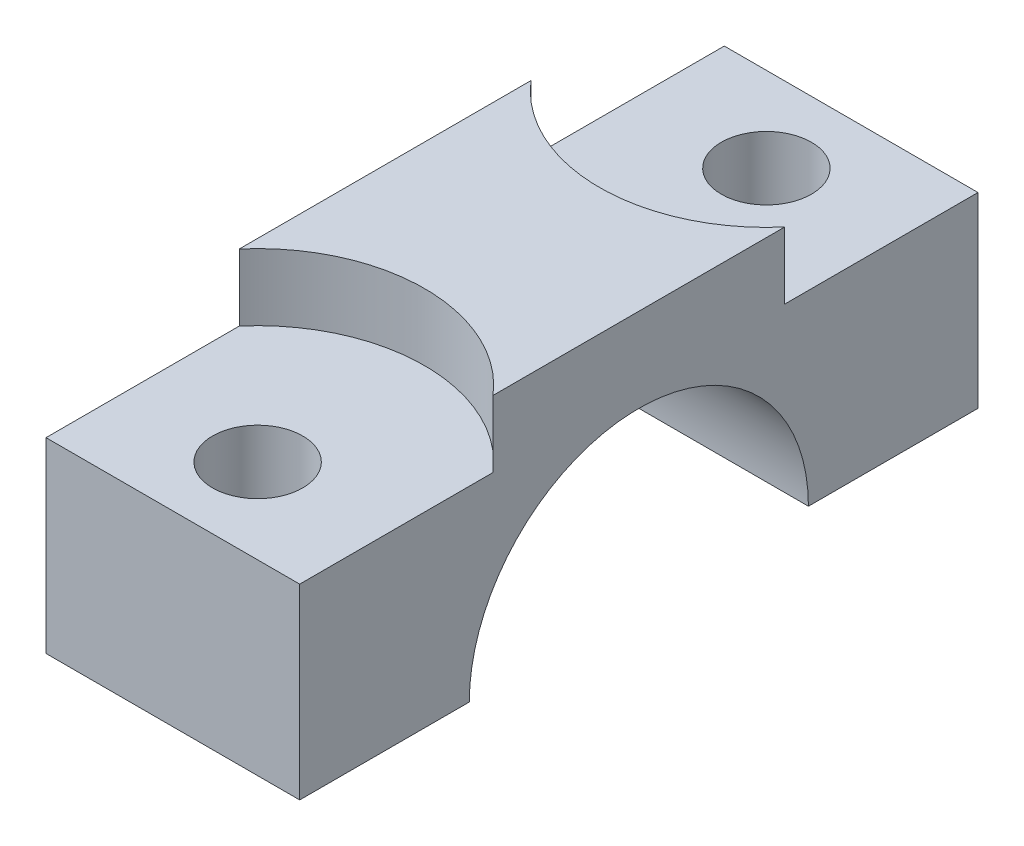
ISO-10303-21;
HEADER;
FILE_DESCRIPTION(('STEP AP214'),'2;1');
FILE_NAME('part.step','',(''),(''),'','','');
FILE_SCHEMA(('AUTOMOTIVE_DESIGN { 1 0 10303 214 1 1 1 1 }'));
ENDSEC;
DATA;
#1=APPLICATION_CONTEXT('core data for automotive mechanical design processes');
#2=APPLICATION_PROTOCOL_DEFINITION('international standard','automotive_design',2000,#1);
#3=PRODUCT_CONTEXT('',#1,'mechanical');
#4=PRODUCT('Part','Part','',(#3));
#5=PRODUCT_RELATED_PRODUCT_CATEGORY('part','',(#4));
#6=PRODUCT_DEFINITION_FORMATION('','',#4);
#7=PRODUCT_DEFINITION_CONTEXT('part definition',#1,'design');
#8=PRODUCT_DEFINITION('design','',#6,#7);
#9=PRODUCT_DEFINITION_SHAPE('','',#8);
#10=(LENGTH_UNIT() NAMED_UNIT(*) SI_UNIT(.MILLI.,.METRE.));
#11=(NAMED_UNIT(*) PLANE_ANGLE_UNIT() SI_UNIT($,.RADIAN.));
#12=(NAMED_UNIT(*) SI_UNIT($,.STERADIAN.) SOLID_ANGLE_UNIT());
#13=UNCERTAINTY_MEASURE_WITH_UNIT(LENGTH_MEASURE(1.E-05),#10,'distance_accuracy_value','');
#14=(GEOMETRIC_REPRESENTATION_CONTEXT(3) GLOBAL_UNCERTAINTY_ASSIGNED_CONTEXT((#13)) GLOBAL_UNIT_ASSIGNED_CONTEXT((#10,
#11,#12)) REPRESENTATION_CONTEXT('',''));
#15=CARTESIAN_POINT('',(0.,0.,0.));
#16=DIRECTION('',(0.,0.,1.));
#17=DIRECTION('',(1.,0.,0.));
#18=AXIS2_PLACEMENT_3D('',#15,#16,#17);
#19=CARTESIAN_POINT('',(9.5,19.,25.4));
#20=DIRECTION('',(0.,0.,-1.));
#21=DIRECTION('',(-1.,0.,0.));
#22=AXIS2_PLACEMENT_3D('',#19,#20,#21);
#23=PLANE('',#22);
#24=DIRECTION('',(0.,-1.,0.));
#25=VECTOR('',#24,1.);
#26=CARTESIAN_POINT('',(9.5,19.,25.4));
#27=LINE('',#26,#25);
#28=CARTESIAN_POINT('',(9.5,14.,25.4));
#29=VERTEX_POINT('',#28);
#30=CARTESIAN_POINT('',(9.5,0.,25.4));
#31=VERTEX_POINT('',#30);
#32=EDGE_CURVE('E167',#29,#31,#27,.T.);
#33=ORIENTED_EDGE('',*,*,#32,.F.);
#34=DIRECTION('',(-1.,0.,0.));
#35=VECTOR('',#34,1.);
#36=CARTESIAN_POINT('',(9.5,14.,25.4));
#37=LINE('',#36,#35);
#38=CARTESIAN_POINT('',(-9.5,14.,25.4));
#39=VERTEX_POINT('',#38);
#40=EDGE_CURVE('E162',#29,#39,#37,.T.);
#41=ORIENTED_EDGE('',*,*,#40,.T.);
#42=DIRECTION('',(0.,-1.,0.));
#43=VECTOR('',#42,1.);
#44=CARTESIAN_POINT('',(-9.5,19.,25.4));
#45=LINE('',#44,#43);
#46=CARTESIAN_POINT('',(-9.5,0.,25.4));
#47=VERTEX_POINT('',#46);
#48=EDGE_CURVE('E166',#39,#47,#45,.T.);
#49=ORIENTED_EDGE('',*,*,#48,.T.);
#50=DIRECTION('',(-1.,0.,0.));
#51=VECTOR('',#50,1.);
#52=CARTESIAN_POINT('',(9.5,0.,25.4));
#53=LINE('',#52,#51);
#54=EDGE_CURVE('E214',#31,#47,#53,.T.);
#55=ORIENTED_EDGE('',*,*,#54,.F.);
#56=EDGE_LOOP('',(#33,#41,#49,#55));
#57=FACE_BOUND('',#56,.T.);
#58=ADVANCED_FACE('F43',(#57),#23,.F.);
#59=CARTESIAN_POINT('',(9.5,0.,25.4));
#60=DIRECTION('',(0.,1.,0.));
#61=DIRECTION('',(0.,0.,1.));
#62=AXIS2_PLACEMENT_3D('',#59,#60,#61);
#63=PLANE('',#62);
#64=CARTESIAN_POINT('',(0.,0.,19.05));
#65=DIRECTION('',(0.,1.,0.));
#66=DIRECTION('',(0.,0.,1.));
#67=AXIS2_PLACEMENT_3D('',#64,#65,#66);
#68=CIRCLE('',#67,3.375);
#69=CARTESIAN_POINT('',(0.,0.,22.425));
#70=VERTEX_POINT('',#69);
#71=EDGE_CURVE('E158',#70,#70,#68,.T.);
#72=ORIENTED_EDGE('',*,*,#71,.T.);
#73=EDGE_LOOP('',(#72));
#74=FACE_BOUND('',#73,.T.);
#75=DIRECTION('',(0.,0.,-1.));
#76=VECTOR('',#75,1.);
#77=CARTESIAN_POINT('',(-9.5,0.,25.4));
#78=LINE('',#77,#76);
#79=CARTESIAN_POINT('',(-9.5,0.,12.7));
#80=VERTEX_POINT('',#79);
#81=EDGE_CURVE('E188',#47,#80,#78,.T.);
#82=ORIENTED_EDGE('',*,*,#81,.T.);
#83=DIRECTION('',(-1.,0.,0.));
#84=VECTOR('',#83,1.);
#85=CARTESIAN_POINT('',(9.5,0.,12.7));
#86=LINE('',#85,#84);
#87=CARTESIAN_POINT('',(9.5,0.,12.7));
#88=VERTEX_POINT('',#87);
#89=EDGE_CURVE('E210',#88,#80,#86,.T.);
#90=ORIENTED_EDGE('',*,*,#89,.F.);
#91=DIRECTION('',(0.,0.,-1.));
#92=VECTOR('',#91,1.);
#93=CARTESIAN_POINT('',(9.5,0.,25.4));
#94=LINE('',#93,#92);
#95=EDGE_CURVE('E170',#31,#88,#94,.T.);
#96=ORIENTED_EDGE('',*,*,#95,.F.);
#97=ORIENTED_EDGE('',*,*,#54,.T.);
#98=EDGE_LOOP('',(#82,#90,#96,#97));
#99=FACE_BOUND('',#98,.T.);
#100=ADVANCED_FACE('F264',(#74,#99),#63,.F.);
#101=CARTESIAN_POINT('',(9.5,0.,0.));
#102=DIRECTION('',(-1.,0.,0.));
#103=DIRECTION('',(0.,0.,1.));
#104=AXIS2_PLACEMENT_3D('',#101,#102,#103);
#105=CYLINDRICAL_SURFACE('',#104,12.7);
#106=CARTESIAN_POINT('',(-9.5,0.,0.));
#107=DIRECTION('',(-1.,0.,0.));
#108=DIRECTION('',(0.,0.,1.));
#109=AXIS2_PLACEMENT_3D('',#106,#107,#108);
#110=CIRCLE('',#109,12.7);
#111=CARTESIAN_POINT('',(-9.5,0.,-12.7));
#112=VERTEX_POINT('',#111);
#113=EDGE_CURVE('E191',#80,#112,#110,.T.);
#114=ORIENTED_EDGE('',*,*,#113,.T.);
#115=DIRECTION('',(-1.,0.,0.));
#116=VECTOR('',#115,1.);
#117=CARTESIAN_POINT('',(9.5,0.,-12.7));
#118=LINE('',#117,#116);
#119=CARTESIAN_POINT('',(9.5,0.,-12.7));
#120=VERTEX_POINT('',#119);
#121=EDGE_CURVE('E206',#120,#112,#118,.T.);
#122=ORIENTED_EDGE('',*,*,#121,.F.);
#123=CARTESIAN_POINT('',(9.5,0.,0.));
#124=DIRECTION('',(-1.,0.,0.));
#125=DIRECTION('',(0.,0.,1.));
#126=AXIS2_PLACEMENT_3D('',#123,#124,#125);
#127=CIRCLE('',#126,12.7);
#128=EDGE_CURVE('E174',#88,#120,#127,.T.);
#129=ORIENTED_EDGE('',*,*,#128,.F.);
#130=ORIENTED_EDGE('',*,*,#89,.T.);
#131=EDGE_LOOP('',(#114,#122,#129,#130));
#132=FACE_BOUND('',#131,.T.);
#133=ADVANCED_FACE('F260',(#132),#105,.F.);
#134=CARTESIAN_POINT('',(9.5,0.,-12.7));
#135=DIRECTION('',(0.,1.,0.));
#136=DIRECTION('',(0.,0.,1.));
#137=AXIS2_PLACEMENT_3D('',#134,#135,#136);
#138=PLANE('',#137);
#139=CARTESIAN_POINT('',(0.,0.,-19.05));
#140=DIRECTION('',(0.,1.,0.));
#141=DIRECTION('',(0.,0.,1.));
#142=AXIS2_PLACEMENT_3D('',#139,#140,#141);
#143=CIRCLE('',#142,3.375);
#144=CARTESIAN_POINT('',(0.,0.,-15.675));
#145=VERTEX_POINT('',#144);
#146=EDGE_CURVE('E145',#145,#145,#143,.T.);
#147=ORIENTED_EDGE('',*,*,#146,.T.);
#148=EDGE_LOOP('',(#147));
#149=FACE_BOUND('',#148,.T.);
#150=DIRECTION('',(0.,0.,-1.));
#151=VECTOR('',#150,1.);
#152=CARTESIAN_POINT('',(-9.5,0.,-12.7));
#153=LINE('',#152,#151);
#154=CARTESIAN_POINT('',(-9.5,0.,-25.4));
#155=VERTEX_POINT('',#154);
#156=EDGE_CURVE('E194',#112,#155,#153,.T.);
#157=ORIENTED_EDGE('',*,*,#156,.T.);
#158=DIRECTION('',(-1.,0.,0.));
#159=VECTOR('',#158,1.);
#160=CARTESIAN_POINT('',(9.5,0.,-25.4));
#161=LINE('',#160,#159);
#162=CARTESIAN_POINT('',(9.5,0.,-25.4));
#163=VERTEX_POINT('',#162);
#164=EDGE_CURVE('E185',#163,#155,#161,.T.);
#165=ORIENTED_EDGE('',*,*,#164,.F.);
#166=DIRECTION('',(0.,0.,-1.));
#167=VECTOR('',#166,1.);
#168=CARTESIAN_POINT('',(9.5,0.,-12.7));
#169=LINE('',#168,#167);
#170=EDGE_CURVE('E177',#120,#163,#169,.T.);
#171=ORIENTED_EDGE('',*,*,#170,.F.);
#172=ORIENTED_EDGE('',*,*,#121,.T.);
#173=EDGE_LOOP('',(#157,#165,#171,#172));
#174=FACE_BOUND('',#173,.T.);
#175=ADVANCED_FACE('F257',(#149,#174),#138,.F.);
#176=CARTESIAN_POINT('',(9.5,19.,-25.4));
#177=DIRECTION('',(0.,0.,1.));
#178=DIRECTION('',(1.,0.,0.));
#179=AXIS2_PLACEMENT_3D('',#176,#177,#178);
#180=PLANE('',#179);
#181=DIRECTION('',(0.,1.,0.));
#182=VECTOR('',#181,1.);
#183=CARTESIAN_POINT('',(-9.5,19.,-25.4));
#184=LINE('',#183,#182);
#185=CARTESIAN_POINT('',(-9.5,14.,-25.4));
#186=VERTEX_POINT('',#185);
#187=EDGE_CURVE('E197',#155,#186,#184,.T.);
#188=ORIENTED_EDGE('',*,*,#187,.T.);
#189=DIRECTION('',(1.,0.,0.));
#190=VECTOR('',#189,1.);
#191=CARTESIAN_POINT('',(9.5,14.,-25.4));
#192=LINE('',#191,#190);
#193=CARTESIAN_POINT('',(9.5,14.,-25.4));
#194=VERTEX_POINT('',#193);
#195=EDGE_CURVE('E58',#186,#194,#192,.T.);
#196=ORIENTED_EDGE('',*,*,#195,.T.);
#197=DIRECTION('',(0.,1.,0.));
#198=VECTOR('',#197,1.);
#199=CARTESIAN_POINT('',(9.5,19.,-25.4));
#200=LINE('',#199,#198);
#201=EDGE_CURVE('E141',#163,#194,#200,.T.);
#202=ORIENTED_EDGE('',*,*,#201,.F.);
#203=ORIENTED_EDGE('',*,*,#164,.T.);
#204=EDGE_LOOP('',(#188,#196,#202,#203));
#205=FACE_BOUND('',#204,.T.);
#206=ADVANCED_FACE('F253',(#205),#180,.F.);
#207=CARTESIAN_POINT('',(9.5,19.,25.4));
#208=DIRECTION('',(0.,-1.,0.));
#209=DIRECTION('',(0.,0.,-1.));
#210=AXIS2_PLACEMENT_3D('',#207,#208,#209);
#211=PLANE('',#210);
#212=DIRECTION('',(0.,0.,1.));
#213=VECTOR('',#212,1.);
#214=CARTESIAN_POINT('',(9.5,19.,25.4));
#215=LINE('',#214,#213);
#216=CARTESIAN_POINT('',(9.5,19.,-10.925961595364));
#217=VERTEX_POINT('',#216);
#218=CARTESIAN_POINT('',(9.5,19.,10.925961595364));
#219=VERTEX_POINT('',#218);
#220=EDGE_CURVE('E182',#217,#219,#215,.T.);
#221=ORIENTED_EDGE('',*,*,#220,.F.);
#222=CARTESIAN_POINT('',(0.,19.,-19.05));
#223=DIRECTION('',(0.,1.,0.));
#224=DIRECTION('',(0.,0.,1.));
#225=AXIS2_PLACEMENT_3D('',#222,#223,#224);
#226=CIRCLE('',#225,12.5);
#227=CARTESIAN_POINT('',(-9.5,19.,-10.925961595364));
#228=VERTEX_POINT('',#227);
#229=EDGE_CURVE('E126',#228,#217,#226,.T.);
#230=ORIENTED_EDGE('',*,*,#229,.F.);
#231=DIRECTION('',(0.,0.,1.));
#232=VECTOR('',#231,1.);
#233=CARTESIAN_POINT('',(-9.5,19.,25.4));
#234=LINE('',#233,#232);
#235=CARTESIAN_POINT('',(-9.5,19.,10.925961595364));
#236=VERTEX_POINT('',#235);
#237=EDGE_CURVE('E171',#228,#236,#234,.T.);
#238=ORIENTED_EDGE('',*,*,#237,.T.);
#239=CARTESIAN_POINT('',(0.,19.,19.05));
#240=DIRECTION('',(0.,1.,0.));
#241=DIRECTION('',(0.,0.,1.));
#242=AXIS2_PLACEMENT_3D('',#239,#240,#241);
#243=CIRCLE('',#242,12.5);
#244=EDGE_CURVE('E131',#219,#236,#243,.T.);
#245=ORIENTED_EDGE('',*,*,#244,.F.);
#246=EDGE_LOOP('',(#221,#230,#238,#245));
#247=FACE_BOUND('',#246,.T.);
#248=ADVANCED_FACE('F249',(#247),#211,.F.);
#249=CARTESIAN_POINT('',(9.5,0.,0.));
#250=DIRECTION('',(-1.,0.,0.));
#251=DIRECTION('',(0.,0.,1.));
#252=AXIS2_PLACEMENT_3D('',#249,#250,#251);
#253=PLANE('',#252);
#254=ORIENTED_EDGE('',*,*,#201,.T.);
#255=DIRECTION('',(0.,0.,1.));
#256=VECTOR('',#255,1.);
#257=CARTESIAN_POINT('',(9.5,14.,0.));
#258=LINE('',#257,#256);
#259=CARTESIAN_POINT('',(9.5,14.,-10.925961595364));
#260=VERTEX_POINT('',#259);
#261=EDGE_CURVE('E132',#194,#260,#258,.T.);
#262=ORIENTED_EDGE('',*,*,#261,.T.);
#263=DIRECTION('',(0.,1.,0.));
#264=VECTOR('',#263,1.);
#265=CARTESIAN_POINT('',(9.5,19.,-10.925961595364));
#266=LINE('',#265,#264);
#267=EDGE_CURVE('E120',#260,#217,#266,.T.);
#268=ORIENTED_EDGE('',*,*,#267,.T.);
#269=ORIENTED_EDGE('',*,*,#220,.T.);
#270=DIRECTION('',(0.,1.,0.));
#271=VECTOR('',#270,1.);
#272=CARTESIAN_POINT('',(9.5,19.,10.925961595364));
#273=LINE('',#272,#271);
#274=CARTESIAN_POINT('',(9.5,14.,10.925961595364));
#275=VERTEX_POINT('',#274);
#276=EDGE_CURVE('E218',#219,#275,#273,.F.);
#277=ORIENTED_EDGE('',*,*,#276,.T.);
#278=DIRECTION('',(0.,0.,1.));
#279=VECTOR('',#278,1.);
#280=CARTESIAN_POINT('',(9.5,14.,0.));
#281=LINE('',#280,#279);
#282=EDGE_CURVE('E222',#275,#29,#281,.T.);
#283=ORIENTED_EDGE('',*,*,#282,.T.);
#284=ORIENTED_EDGE('',*,*,#32,.T.);
#285=ORIENTED_EDGE('',*,*,#95,.T.);
#286=ORIENTED_EDGE('',*,*,#128,.T.);
#287=ORIENTED_EDGE('',*,*,#170,.T.);
#288=EDGE_LOOP('',(#254,#262,#268,#269,#277,#283,#284,#285,#286,#287));
#289=FACE_BOUND('',#288,.T.);
#290=ADVANCED_FACE('F139',(#289),#253,.F.);
#291=CARTESIAN_POINT('',(-9.5,0.,0.));
#292=DIRECTION('',(-1.,0.,0.));
#293=DIRECTION('',(0.,0.,1.));
#294=AXIS2_PLACEMENT_3D('',#291,#292,#293);
#295=PLANE('',#294);
#296=DIRECTION('',(0.,1.,0.));
#297=VECTOR('',#296,1.);
#298=CARTESIAN_POINT('',(-9.5,19.,-10.925961595364));
#299=LINE('',#298,#297);
#300=CARTESIAN_POINT('',(-9.5,14.,-10.925961595364));
#301=VERTEX_POINT('',#300);
#302=EDGE_CURVE('E11',#301,#228,#299,.T.);
#303=ORIENTED_EDGE('',*,*,#302,.F.);
#304=DIRECTION('',(0.,0.,1.));
#305=VECTOR('',#304,1.);
#306=CARTESIAN_POINT('',(-9.5,14.,0.));
#307=LINE('',#306,#305);
#308=EDGE_CURVE('E51',#186,#301,#307,.T.);
#309=ORIENTED_EDGE('',*,*,#308,.F.);
#310=ORIENTED_EDGE('',*,*,#187,.F.);
#311=ORIENTED_EDGE('',*,*,#156,.F.);
#312=ORIENTED_EDGE('',*,*,#113,.F.);
#313=ORIENTED_EDGE('',*,*,#81,.F.);
#314=ORIENTED_EDGE('',*,*,#48,.F.);
#315=DIRECTION('',(0.,0.,1.));
#316=VECTOR('',#315,1.);
#317=CARTESIAN_POINT('',(-9.5,14.,0.));
#318=LINE('',#317,#316);
#319=CARTESIAN_POINT('',(-9.5,14.,10.925961595364));
#320=VERTEX_POINT('',#319);
#321=EDGE_CURVE('E226',#320,#39,#318,.T.);
#322=ORIENTED_EDGE('',*,*,#321,.F.);
#323=DIRECTION('',(0.,1.,0.));
#324=VECTOR('',#323,1.);
#325=CARTESIAN_POINT('',(-9.5,19.,10.925961595364));
#326=LINE('',#325,#324);
#327=EDGE_CURVE('E229',#236,#320,#326,.F.);
#328=ORIENTED_EDGE('',*,*,#327,.F.);
#329=ORIENTED_EDGE('',*,*,#237,.F.);
#330=EDGE_LOOP('',(#303,#309,#310,#311,#312,#313,#314,#322,#328,#329));
#331=FACE_BOUND('',#330,.T.);
#332=ADVANCED_FACE('F241',(#331),#295,.T.);
#333=CARTESIAN_POINT('',(3.375,14.,19.05));
#334=DIRECTION('',(0.,-1.,0.));
#335=DIRECTION('',(0.,0.,-1.));
#336=AXIS2_PLACEMENT_3D('',#333,#334,#335);
#337=PLANE('',#336);
#338=CARTESIAN_POINT('',(0.,14.,19.05));
#339=DIRECTION('',(0.,1.,0.));
#340=DIRECTION('',(0.,0.,1.));
#341=AXIS2_PLACEMENT_3D('',#338,#339,#340);
#342=CIRCLE('',#341,3.375);
#343=CARTESIAN_POINT('',(0.,14.,22.425));
#344=VERTEX_POINT('',#343);
#345=EDGE_CURVE('E154',#344,#344,#342,.T.);
#346=ORIENTED_EDGE('',*,*,#345,.F.);
#347=EDGE_LOOP('',(#346));
#348=FACE_BOUND('',#347,.T.);
#349=CARTESIAN_POINT('',(0.,14.,19.05));
#350=DIRECTION('',(0.,1.,0.));
#351=DIRECTION('',(0.,0.,1.));
#352=AXIS2_PLACEMENT_3D('',#349,#350,#351);
#353=CIRCLE('',#352,12.5);
#354=EDGE_CURVE('E66',#275,#320,#353,.T.);
#355=ORIENTED_EDGE('',*,*,#354,.T.);
#356=ORIENTED_EDGE('',*,*,#321,.T.);
#357=ORIENTED_EDGE('',*,*,#40,.F.);
#358=ORIENTED_EDGE('',*,*,#282,.F.);
#359=EDGE_LOOP('',(#355,#356,#357,#358));
#360=FACE_BOUND('',#359,.T.);
#361=ADVANCED_FACE('F239',(#348,#360),#337,.F.);
#362=CARTESIAN_POINT('',(0.,19.,19.05));
#363=DIRECTION('',(0.,1.,0.));
#364=DIRECTION('',(0.,0.,1.));
#365=AXIS2_PLACEMENT_3D('',#362,#363,#364);
#366=CYLINDRICAL_SURFACE('',#365,3.375);
#367=ORIENTED_EDGE('',*,*,#71,.F.);
#368=EDGE_LOOP('',(#367));
#369=FACE_BOUND('',#368,.T.);
#370=ORIENTED_EDGE('',*,*,#345,.T.);
#371=EDGE_LOOP('',(#370));
#372=FACE_BOUND('',#371,.T.);
#373=ADVANCED_FACE('F284',(#369,#372),#366,.F.);
#374=CARTESIAN_POINT('',(0.,19.,19.05));
#375=DIRECTION('',(0.,1.,0.));
#376=DIRECTION('',(0.,0.,1.));
#377=AXIS2_PLACEMENT_3D('',#374,#375,#376);
#378=CYLINDRICAL_SURFACE('',#377,12.5);
#379=ORIENTED_EDGE('',*,*,#327,.T.);
#380=ORIENTED_EDGE('',*,*,#354,.F.);
#381=ORIENTED_EDGE('',*,*,#276,.F.);
#382=ORIENTED_EDGE('',*,*,#244,.T.);
#383=EDGE_LOOP('',(#379,#380,#381,#382));
#384=FACE_BOUND('',#383,.T.);
#385=ADVANCED_FACE('F233',(#384),#378,.F.);
#386=CARTESIAN_POINT('',(0.,19.,-19.05));
#387=DIRECTION('',(0.,1.,0.));
#388=DIRECTION('',(0.,0.,1.));
#389=AXIS2_PLACEMENT_3D('',#386,#387,#388);
#390=CYLINDRICAL_SURFACE('',#389,12.5);
#391=CARTESIAN_POINT('',(0.,14.,-19.05));
#392=DIRECTION('',(0.,1.,0.));
#393=DIRECTION('',(0.,0.,1.));
#394=AXIS2_PLACEMENT_3D('',#391,#392,#393);
#395=CIRCLE('',#394,12.5);
#396=EDGE_CURVE('E123',#301,#260,#395,.T.);
#397=ORIENTED_EDGE('',*,*,#396,.F.);
#398=ORIENTED_EDGE('',*,*,#302,.T.);
#399=ORIENTED_EDGE('',*,*,#229,.T.);
#400=ORIENTED_EDGE('',*,*,#267,.F.);
#401=EDGE_LOOP('',(#397,#398,#399,#400));
#402=FACE_BOUND('',#401,.T.);
#403=ADVANCED_FACE('F122',(#402),#390,.F.);
#404=CARTESIAN_POINT('',(3.375,14.,-19.05));
#405=DIRECTION('',(0.,-1.,0.));
#406=DIRECTION('',(0.,0.,-1.));
#407=AXIS2_PLACEMENT_3D('',#404,#405,#406);
#408=PLANE('',#407);
#409=CARTESIAN_POINT('',(0.,14.,-19.05));
#410=DIRECTION('',(0.,1.,0.));
#411=DIRECTION('',(0.,0.,1.));
#412=AXIS2_PLACEMENT_3D('',#409,#410,#411);
#413=CIRCLE('',#412,3.375);
#414=CARTESIAN_POINT('',(0.,14.,-15.675));
#415=VERTEX_POINT('',#414);
#416=EDGE_CURVE('E136',#415,#415,#413,.T.);
#417=ORIENTED_EDGE('',*,*,#416,.F.);
#418=EDGE_LOOP('',(#417));
#419=FACE_BOUND('',#418,.T.);
#420=ORIENTED_EDGE('',*,*,#195,.F.);
#421=ORIENTED_EDGE('',*,*,#308,.T.);
#422=ORIENTED_EDGE('',*,*,#396,.T.);
#423=ORIENTED_EDGE('',*,*,#261,.F.);
#424=EDGE_LOOP('',(#420,#421,#422,#423));
#425=FACE_BOUND('',#424,.T.);
#426=ADVANCED_FACE('F134',(#419,#425),#408,.F.);
#427=CARTESIAN_POINT('',(0.,19.,-19.05));
#428=DIRECTION('',(0.,1.,0.));
#429=DIRECTION('',(0.,0.,1.));
#430=AXIS2_PLACEMENT_3D('',#427,#428,#429);
#431=CYLINDRICAL_SURFACE('',#430,3.375);
#432=ORIENTED_EDGE('',*,*,#146,.F.);
#433=EDGE_LOOP('',(#432));
#434=FACE_BOUND('',#433,.T.);
#435=ORIENTED_EDGE('',*,*,#416,.T.);
#436=EDGE_LOOP('',(#435));
#437=FACE_BOUND('',#436,.T.);
#438=ADVANCED_FACE('F293',(#434,#437),#431,.F.);
#439=CLOSED_SHELL('',(#58,#100,#133,#175,#206,#248,#290,#332,#361,#373,#385,#403,#426,#438));
#440=MANIFOLD_SOLID_BREP('B2',#439);
#441=ADVANCED_BREP_SHAPE_REPRESENTATION('',(#18,#440),#14);
#442=SHAPE_DEFINITION_REPRESENTATION(#9,#441);
ENDSEC;
END-ISO-10303-21;
